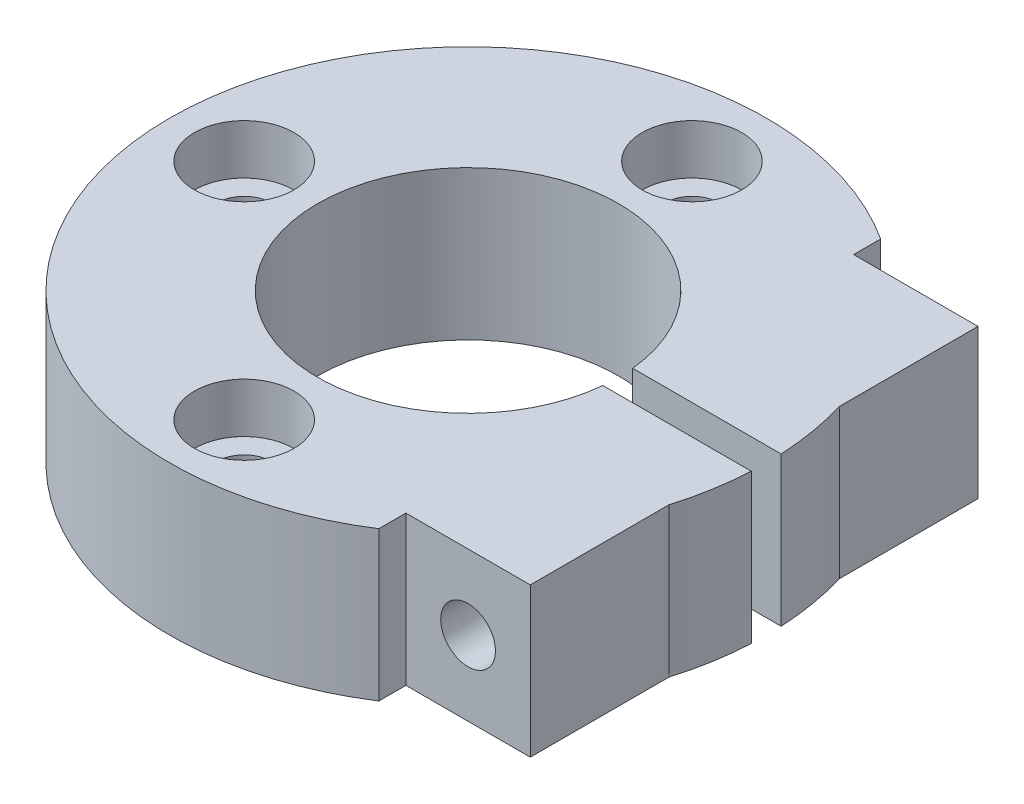
ISO-10303-21;
HEADER;
FILE_DESCRIPTION(('STEP AP214'),'2;1');
FILE_NAME('part.step','',(''),(''),'','','');
FILE_SCHEMA(('AUTOMOTIVE_DESIGN { 1 0 10303 214 1 1 1 1 }'));
ENDSEC;
DATA;
#1=APPLICATION_CONTEXT('core data for automotive mechanical design processes');
#2=APPLICATION_PROTOCOL_DEFINITION('international standard','automotive_design',2000,#1);
#3=PRODUCT_CONTEXT('',#1,'mechanical');
#4=PRODUCT('Part','Part','',(#3));
#5=PRODUCT_RELATED_PRODUCT_CATEGORY('part','',(#4));
#6=PRODUCT_DEFINITION_FORMATION('','',#4);
#7=PRODUCT_DEFINITION_CONTEXT('part definition',#1,'design');
#8=PRODUCT_DEFINITION('design','',#6,#7);
#9=PRODUCT_DEFINITION_SHAPE('','',#8);
#10=(LENGTH_UNIT() NAMED_UNIT(*) SI_UNIT(.MILLI.,.METRE.));
#11=(NAMED_UNIT(*) PLANE_ANGLE_UNIT() SI_UNIT($,.RADIAN.));
#12=(NAMED_UNIT(*) SI_UNIT($,.STERADIAN.) SOLID_ANGLE_UNIT());
#13=UNCERTAINTY_MEASURE_WITH_UNIT(LENGTH_MEASURE(1.E-05),#10,'distance_accuracy_value','');
#14=(GEOMETRIC_REPRESENTATION_CONTEXT(3) GLOBAL_UNCERTAINTY_ASSIGNED_CONTEXT((#13)) GLOBAL_UNIT_ASSIGNED_CONTEXT((#10,
#11,#12)) REPRESENTATION_CONTEXT('',''));
#15=CARTESIAN_POINT('',(0.,0.,0.));
#16=DIRECTION('',(0.,0.,1.));
#17=DIRECTION('',(1.,0.,0.));
#18=AXIS2_PLACEMENT_3D('',#15,#16,#17);
#19=CARTESIAN_POINT('',(-56.2916512459897,161.,0.));
#20=DIRECTION('',(0.,1.,0.));
#21=DIRECTION('',(0.,0.,-1.));
#22=AXIS2_PLACEMENT_3D('',#19,#20,#21);
#23=PLANE('',#22);
#24=CARTESIAN_POINT('',(-65.2916512459885,161.,0.));
#25=DIRECTION('',(0.,-1.,0.));
#26=DIRECTION('',(0.,0.,-1.));
#27=AXIS2_PLACEMENT_3D('',#24,#25,#26);
#28=CIRCLE('',#27,1.1);
#29=CARTESIAN_POINT('',(-65.2916512459885,161.,-1.1));
#30=VERTEX_POINT('',#29);
#31=EDGE_CURVE('E198',#30,#30,#28,.T.);
#32=ORIENTED_EDGE('',*,*,#31,.T.);
#33=EDGE_LOOP('',(#32));
#34=FACE_BOUND('',#33,.T.);
#35=CARTESIAN_POINT('',(-65.2916512459885,161.,0.));
#36=DIRECTION('',(0.,-1.,0.));
#37=DIRECTION('',(0.,0.,-1.));
#38=AXIS2_PLACEMENT_3D('',#35,#36,#37);
#39=CIRCLE('',#38,2.);
#40=CARTESIAN_POINT('',(-65.2916512459885,161.,-2.));
#41=VERTEX_POINT('',#40);
#42=EDGE_CURVE('E153',#41,#41,#39,.T.);
#43=ORIENTED_EDGE('',*,*,#42,.F.);
#44=EDGE_LOOP('',(#43));
#45=FACE_BOUND('',#44,.T.);
#46=ADVANCED_FACE('F41',(#34,#45),#23,.T.);
#47=CARTESIAN_POINT('',(-56.2916512459885,161.,-9.));
#48=DIRECTION('',(0.,-1.,0.));
#49=DIRECTION('',(0.,0.,-1.));
#50=AXIS2_PLACEMENT_3D('',#47,#48,#49);
#51=CIRCLE('',#50,1.1);
#52=CARTESIAN_POINT('',(-56.2916512459885,161.,-10.1));
#53=VERTEX_POINT('',#52);
#54=EDGE_CURVE('E188',#53,#53,#51,.T.);
#55=ORIENTED_EDGE('',*,*,#54,.T.);
#56=EDGE_LOOP('',(#55));
#57=FACE_BOUND('',#56,.T.);
#58=CARTESIAN_POINT('',(-56.2916512459885,161.,-9.));
#59=DIRECTION('',(0.,-1.,0.));
#60=DIRECTION('',(0.,0.,-1.));
#61=AXIS2_PLACEMENT_3D('',#58,#59,#60);
#62=CIRCLE('',#61,2.);
#63=CARTESIAN_POINT('',(-56.2916512459885,161.,-11.));
#64=VERTEX_POINT('',#63);
#65=EDGE_CURVE('E322',#64,#64,#62,.T.);
#66=ORIENTED_EDGE('',*,*,#65,.F.);
#67=EDGE_LOOP('',(#66));
#68=FACE_BOUND('',#67,.T.);
#69=ADVANCED_FACE('F300',(#57,#68),#23,.T.);
#70=CARTESIAN_POINT('',(-56.2916512459885,161.,9.));
#71=DIRECTION('',(0.,-1.,0.));
#72=DIRECTION('',(0.,0.,-1.));
#73=AXIS2_PLACEMENT_3D('',#70,#71,#72);
#74=CIRCLE('',#73,1.1);
#75=CARTESIAN_POINT('',(-56.2916512459885,161.,7.9));
#76=VERTEX_POINT('',#75);
#77=EDGE_CURVE('E184',#76,#76,#74,.T.);
#78=ORIENTED_EDGE('',*,*,#77,.T.);
#79=EDGE_LOOP('',(#78));
#80=FACE_BOUND('',#79,.T.);
#81=CARTESIAN_POINT('',(-56.2916512459885,161.,9.));
#82=DIRECTION('',(0.,-1.,0.));
#83=DIRECTION('',(0.,0.,-1.));
#84=AXIS2_PLACEMENT_3D('',#81,#82,#83);
#85=CIRCLE('',#84,2.);
#86=CARTESIAN_POINT('',(-56.2916512459885,161.,7.));
#87=VERTEX_POINT('',#86);
#88=EDGE_CURVE('E318',#87,#87,#85,.T.);
#89=ORIENTED_EDGE('',*,*,#88,.F.);
#90=EDGE_LOOP('',(#89));
#91=FACE_BOUND('',#90,.T.);
#92=ADVANCED_FACE('F301',(#80,#91),#23,.T.);
#93=CARTESIAN_POINT('',(-56.2916512459897,157.,0.));
#94=DIRECTION('',(0.,1.,0.));
#95=DIRECTION('',(0.,0.,-1.));
#96=AXIS2_PLACEMENT_3D('',#93,#94,#95);
#97=PLANE('',#96);
#98=CARTESIAN_POINT('',(-56.2916512459897,157.,0.));
#99=DIRECTION('',(0.,-1.,0.));
#100=DIRECTION('',(0.,0.,-1.));
#101=AXIS2_PLACEMENT_3D('',#98,#99,#100);
#102=CIRCLE('',#101,12.0000000000012);
#103=CARTESIAN_POINT('',(-44.3066606327256,157.,0.599999999999992));
#104=VERTEX_POINT('',#103);
#105=CARTESIAN_POINT('',(-44.7916512459885,157.,3.42782730020053));
#106=VERTEX_POINT('',#105);
#107=EDGE_CURVE('E200',#104,#106,#102,.T.);
#108=ORIENTED_EDGE('',*,*,#107,.T.);
#109=DIRECTION('',(0.,0.,1.));
#110=VECTOR('',#109,1.);
#111=CARTESIAN_POINT('',(-44.7916512459885,157.,3.42782730020053));
#112=LINE('',#111,#110);
#113=CARTESIAN_POINT('',(-44.7916512459885,157.,9.));
#114=VERTEX_POINT('',#113);
#115=EDGE_CURVE('E148',#106,#114,#112,.T.);
#116=ORIENTED_EDGE('',*,*,#115,.T.);
#117=DIRECTION('',(-1.,0.,0.));
#118=VECTOR('',#117,1.);
#119=CARTESIAN_POINT('',(-44.7916512459885,157.,9.));
#120=LINE('',#119,#118);
#121=CARTESIAN_POINT('',(-49.7916512459885,157.,9.));
#122=VERTEX_POINT('',#121);
#123=EDGE_CURVE('E204',#114,#122,#120,.T.);
#124=ORIENTED_EDGE('',*,*,#123,.T.);
#125=DIRECTION('',(0.,0.,1.));
#126=VECTOR('',#125,1.);
#127=CARTESIAN_POINT('',(-49.7916512459885,157.,9.));
#128=LINE('',#127,#126);
#129=CARTESIAN_POINT('',(-49.7916512459885,157.,10.087120500916));
#130=VERTEX_POINT('',#129);
#131=EDGE_CURVE('E210',#122,#130,#128,.T.);
#132=ORIENTED_EDGE('',*,*,#131,.T.);
#133=CARTESIAN_POINT('',(-56.2916512459897,157.,0.));
#134=DIRECTION('',(0.,-1.,0.));
#135=DIRECTION('',(0.,0.,-1.));
#136=AXIS2_PLACEMENT_3D('',#133,#134,#135);
#137=CIRCLE('',#136,12.0000000000006);
#138=CARTESIAN_POINT('',(-49.7916512459885,157.,-10.087120500916));
#139=VERTEX_POINT('',#138);
#140=EDGE_CURVE('E209',#130,#139,#137,.T.);
#141=ORIENTED_EDGE('',*,*,#140,.T.);
#142=DIRECTION('',(0.,0.,1.));
#143=VECTOR('',#142,1.);
#144=CARTESIAN_POINT('',(-49.7916512459885,157.,-10.087120500916));
#145=LINE('',#144,#143);
#146=CARTESIAN_POINT('',(-49.7916512459885,157.,-9.));
#147=VERTEX_POINT('',#146);
#148=EDGE_CURVE('E213',#139,#147,#145,.T.);
#149=ORIENTED_EDGE('',*,*,#148,.T.);
#150=DIRECTION('',(1.,0.,0.));
#151=VECTOR('',#150,1.);
#152=CARTESIAN_POINT('',(-44.7916512459885,157.,-9.));
#153=LINE('',#152,#151);
#154=CARTESIAN_POINT('',(-44.7916512459885,157.,-9.));
#155=VERTEX_POINT('',#154);
#156=EDGE_CURVE('E216',#147,#155,#153,.T.);
#157=ORIENTED_EDGE('',*,*,#156,.T.);
#158=DIRECTION('',(0.,0.,1.));
#159=VECTOR('',#158,1.);
#160=CARTESIAN_POINT('',(-44.7916512459885,157.,-9.));
#161=LINE('',#160,#159);
#162=CARTESIAN_POINT('',(-44.7916512459885,157.,-3.42782730020053));
#163=VERTEX_POINT('',#162);
#164=EDGE_CURVE('E218',#155,#163,#161,.T.);
#165=ORIENTED_EDGE('',*,*,#164,.T.);
#166=CARTESIAN_POINT('',(-56.2916512459897,157.,0.));
#167=DIRECTION('',(0.,-1.,0.));
#168=DIRECTION('',(0.,0.,-1.));
#169=AXIS2_PLACEMENT_3D('',#166,#167,#168);
#170=CIRCLE('',#169,12.0000000000012);
#171=CARTESIAN_POINT('',(-44.3066606327256,157.,-0.6));
#172=VERTEX_POINT('',#171);
#173=EDGE_CURVE('E225',#163,#172,#170,.T.);
#174=ORIENTED_EDGE('',*,*,#173,.T.);
#175=DIRECTION('',(-1.,0.,0.));
#176=VECTOR('',#175,1.);
#177=CARTESIAN_POINT('',(-44.3066606327256,157.,-0.6));
#178=LINE('',#177,#176);
#179=CARTESIAN_POINT('',(-50.2714768299106,157.,-0.600000000000006));
#180=VERTEX_POINT('',#179);
#181=EDGE_CURVE('E223',#172,#180,#178,.T.);
#182=ORIENTED_EDGE('',*,*,#181,.T.);
#183=CARTESIAN_POINT('',(-56.2916512459897,157.,0.));
#184=DIRECTION('',(0.,1.,0.));
#185=DIRECTION('',(0.,0.,-1.));
#186=AXIS2_PLACEMENT_3D('',#183,#184,#185);
#187=CIRCLE('',#186,6.05000000000116);
#188=CARTESIAN_POINT('',(-50.2714768299105,157.,0.599999999999976));
#189=VERTEX_POINT('',#188);
#190=EDGE_CURVE('E230',#180,#189,#187,.T.);
#191=ORIENTED_EDGE('',*,*,#190,.T.);
#192=DIRECTION('',(1.,0.,0.));
#193=VECTOR('',#192,1.);
#194=CARTESIAN_POINT('',(-44.3066606327256,157.,0.599999999999992));
#195=LINE('',#194,#193);
#196=EDGE_CURVE('E231',#189,#104,#195,.T.);
#197=ORIENTED_EDGE('',*,*,#196,.T.);
#198=EDGE_LOOP('',(#108,#116,#124,#132,#141,#149,#157,#165,#174,#182,#191,#197));
#199=FACE_BOUND('',#198,.T.);
#200=CARTESIAN_POINT('',(-65.2916512459885,157.,0.));
#201=DIRECTION('',(0.,-1.,0.));
#202=DIRECTION('',(0.,0.,-1.));
#203=AXIS2_PLACEMENT_3D('',#200,#201,#202);
#204=CIRCLE('',#203,1.1);
#205=CARTESIAN_POINT('',(-65.2916512459885,157.,-1.1));
#206=VERTEX_POINT('',#205);
#207=EDGE_CURVE('E194',#206,#206,#204,.T.);
#208=ORIENTED_EDGE('',*,*,#207,.F.);
#209=EDGE_LOOP('',(#208));
#210=FACE_BOUND('',#209,.T.);
#211=CARTESIAN_POINT('',(-56.2916512459885,157.,-9.));
#212=DIRECTION('',(0.,-1.,0.));
#213=DIRECTION('',(0.,0.,-1.));
#214=AXIS2_PLACEMENT_3D('',#211,#212,#213);
#215=CIRCLE('',#214,1.1);
#216=CARTESIAN_POINT('',(-56.2916512459885,157.,-10.1));
#217=VERTEX_POINT('',#216);
#218=EDGE_CURVE('E189',#217,#217,#215,.T.);
#219=ORIENTED_EDGE('',*,*,#218,.F.);
#220=EDGE_LOOP('',(#219));
#221=FACE_BOUND('',#220,.T.);
#222=CARTESIAN_POINT('',(-56.2916512459885,157.,9.));
#223=DIRECTION('',(0.,-1.,0.));
#224=DIRECTION('',(0.,0.,-1.));
#225=AXIS2_PLACEMENT_3D('',#222,#223,#224);
#226=CIRCLE('',#225,1.1);
#227=CARTESIAN_POINT('',(-56.2916512459885,157.,7.9));
#228=VERTEX_POINT('',#227);
#229=EDGE_CURVE('E181',#228,#228,#226,.T.);
#230=ORIENTED_EDGE('',*,*,#229,.F.);
#231=EDGE_LOOP('',(#230));
#232=FACE_BOUND('',#231,.T.);
#233=ADVANCED_FACE('F260',(#199,#210,#221,#232),#97,.F.);
#234=CARTESIAN_POINT('',(-56.2916512459897,161.,0.));
#235=DIRECTION('',(0.,-1.,0.));
#236=DIRECTION('',(0.,0.,1.));
#237=AXIS2_PLACEMENT_3D('',#234,#235,#236);
#238=CYLINDRICAL_SURFACE('',#237,12.0000000000012);
#239=ORIENTED_EDGE('',*,*,#107,.F.);
#240=DIRECTION('',(0.,-1.,0.));
#241=VECTOR('',#240,1.);
#242=CARTESIAN_POINT('',(-44.3066606327256,161.,0.599999999999992));
#243=LINE('',#242,#241);
#244=CARTESIAN_POINT('',(-44.3066606327256,163.,0.599999999999992));
#245=VERTEX_POINT('',#244);
#246=EDGE_CURVE('E60',#245,#104,#243,.T.);
#247=ORIENTED_EDGE('',*,*,#246,.F.);
#248=CARTESIAN_POINT('',(-56.2916512459897,163.,0.));
#249=DIRECTION('',(0.,-1.,0.));
#250=DIRECTION('',(0.,0.,-1.));
#251=AXIS2_PLACEMENT_3D('',#248,#249,#250);
#252=CIRCLE('',#251,12.0000000000012);
#253=CARTESIAN_POINT('',(-44.7916512459885,163.,3.42782730020053));
#254=VERTEX_POINT('',#253);
#255=EDGE_CURVE('E137',#245,#254,#252,.T.);
#256=ORIENTED_EDGE('',*,*,#255,.T.);
#257=DIRECTION('',(0.,-1.,0.));
#258=VECTOR('',#257,1.);
#259=CARTESIAN_POINT('',(-44.7916512459885,161.,3.42782730020053));
#260=LINE('',#259,#258);
#261=EDGE_CURVE('E11',#254,#106,#260,.T.);
#262=ORIENTED_EDGE('',*,*,#261,.T.);
#263=EDGE_LOOP('',(#239,#247,#256,#262));
#264=FACE_BOUND('',#263,.T.);
#265=ADVANCED_FACE('F43',(#264),#238,.T.);
#266=CARTESIAN_POINT('',(-44.7916512459885,161.,3.42782730020053));
#267=DIRECTION('',(-1.,0.,0.));
#268=DIRECTION('',(0.,0.,1.));
#269=AXIS2_PLACEMENT_3D('',#266,#267,#268);
#270=PLANE('',#269);
#271=ORIENTED_EDGE('',*,*,#115,.F.);
#272=ORIENTED_EDGE('',*,*,#261,.F.);
#273=DIRECTION('',(0.,0.,1.));
#274=VECTOR('',#273,1.);
#275=CARTESIAN_POINT('',(-44.7916512459885,163.,3.42782730020053));
#276=LINE('',#275,#274);
#277=CARTESIAN_POINT('',(-44.7916512459885,163.,9.));
#278=VERTEX_POINT('',#277);
#279=EDGE_CURVE('E134',#254,#278,#276,.T.);
#280=ORIENTED_EDGE('',*,*,#279,.T.);
#281=DIRECTION('',(0.,-1.,0.));
#282=VECTOR('',#281,1.);
#283=CARTESIAN_POINT('',(-44.7916512459885,161.,9.));
#284=LINE('',#283,#282);
#285=EDGE_CURVE('E49',#278,#114,#284,.T.);
#286=ORIENTED_EDGE('',*,*,#285,.T.);
#287=EDGE_LOOP('',(#271,#272,#280,#286));
#288=FACE_BOUND('',#287,.T.);
#289=ADVANCED_FACE('F145',(#288),#270,.F.);
#290=CARTESIAN_POINT('',(-44.7916512459885,161.,9.));
#291=DIRECTION('',(0.,0.,-1.));
#292=DIRECTION('',(-1.,0.,0.));
#293=AXIS2_PLACEMENT_3D('',#290,#291,#292);
#294=PLANE('',#293);
#295=CARTESIAN_POINT('',(-47.2916512459885,160.,9.));
#296=DIRECTION('',(0.,0.,1.));
#297=DIRECTION('',(-1.,0.,0.));
#298=AXIS2_PLACEMENT_3D('',#295,#296,#297);
#299=CIRCLE('',#298,1.1);
#300=CARTESIAN_POINT('',(-48.3916512459885,160.,9.));
#301=VERTEX_POINT('',#300);
#302=EDGE_CURVE('E321',#301,#301,#299,.F.);
#303=ORIENTED_EDGE('',*,*,#302,.T.);
#304=EDGE_LOOP('',(#303));
#305=FACE_BOUND('',#304,.T.);
#306=ORIENTED_EDGE('',*,*,#123,.F.);
#307=ORIENTED_EDGE('',*,*,#285,.F.);
#308=DIRECTION('',(-1.,0.,0.));
#309=VECTOR('',#308,1.);
#310=CARTESIAN_POINT('',(-44.7916512459885,163.,9.));
#311=LINE('',#310,#309);
#312=CARTESIAN_POINT('',(-49.7916512459885,163.,9.));
#313=VERTEX_POINT('',#312);
#314=EDGE_CURVE('E138',#278,#313,#311,.T.);
#315=ORIENTED_EDGE('',*,*,#314,.T.);
#316=DIRECTION('',(0.,-1.,0.));
#317=VECTOR('',#316,1.);
#318=CARTESIAN_POINT('',(-49.7916512459885,161.,9.));
#319=LINE('',#318,#317);
#320=EDGE_CURVE('E248',#313,#122,#319,.T.);
#321=ORIENTED_EDGE('',*,*,#320,.T.);
#322=EDGE_LOOP('',(#306,#307,#315,#321));
#323=FACE_BOUND('',#322,.T.);
#324=ADVANCED_FACE('F251',(#305,#323),#294,.F.);
#325=CARTESIAN_POINT('',(-49.7916512459885,161.,9.));
#326=DIRECTION('',(-1.,0.,0.));
#327=DIRECTION('',(0.,0.,1.));
#328=AXIS2_PLACEMENT_3D('',#325,#326,#327);
#329=PLANE('',#328);
#330=ORIENTED_EDGE('',*,*,#131,.F.);
#331=ORIENTED_EDGE('',*,*,#320,.F.);
#332=DIRECTION('',(0.,0.,1.));
#333=VECTOR('',#332,1.);
#334=CARTESIAN_POINT('',(-49.7916512459885,163.,9.));
#335=LINE('',#334,#333);
#336=CARTESIAN_POINT('',(-49.7916512459885,163.,10.087120500916));
#337=VERTEX_POINT('',#336);
#338=EDGE_CURVE('E158',#313,#337,#335,.T.);
#339=ORIENTED_EDGE('',*,*,#338,.T.);
#340=DIRECTION('',(0.,-1.,0.));
#341=VECTOR('',#340,1.);
#342=CARTESIAN_POINT('',(-49.7916512459885,161.,10.087120500916));
#343=LINE('',#342,#341);
#344=EDGE_CURVE('E247',#337,#130,#343,.T.);
#345=ORIENTED_EDGE('',*,*,#344,.T.);
#346=EDGE_LOOP('',(#330,#331,#339,#345));
#347=FACE_BOUND('',#346,.T.);
#348=ADVANCED_FACE('F287',(#347),#329,.F.);
#349=CARTESIAN_POINT('',(-56.2916512459897,161.,0.));
#350=DIRECTION('',(0.,-1.,0.));
#351=DIRECTION('',(0.,0.,1.));
#352=AXIS2_PLACEMENT_3D('',#349,#350,#351);
#353=CYLINDRICAL_SURFACE('',#352,12.0000000000006);
#354=ORIENTED_EDGE('',*,*,#140,.F.);
#355=ORIENTED_EDGE('',*,*,#344,.F.);
#356=CARTESIAN_POINT('',(-56.2916512459897,163.,0.));
#357=DIRECTION('',(0.,-1.,0.));
#358=DIRECTION('',(0.,0.,-1.));
#359=AXIS2_PLACEMENT_3D('',#356,#357,#358);
#360=CIRCLE('',#359,12.0000000000006);
#361=CARTESIAN_POINT('',(-49.7916512459885,163.,-10.087120500916));
#362=VERTEX_POINT('',#361);
#363=EDGE_CURVE('E161',#337,#362,#360,.T.);
#364=ORIENTED_EDGE('',*,*,#363,.T.);
#365=DIRECTION('',(0.,-1.,0.));
#366=VECTOR('',#365,1.);
#367=CARTESIAN_POINT('',(-49.7916512459885,161.,-10.087120500916));
#368=LINE('',#367,#366);
#369=EDGE_CURVE('E243',#362,#139,#368,.T.);
#370=ORIENTED_EDGE('',*,*,#369,.T.);
#371=EDGE_LOOP('',(#354,#355,#364,#370));
#372=FACE_BOUND('',#371,.T.);
#373=ADVANCED_FACE('F283',(#372),#353,.T.);
#374=CARTESIAN_POINT('',(-49.7916512459885,161.,-10.087120500916));
#375=DIRECTION('',(-1.,0.,0.));
#376=DIRECTION('',(0.,0.,1.));
#377=AXIS2_PLACEMENT_3D('',#374,#375,#376);
#378=PLANE('',#377);
#379=ORIENTED_EDGE('',*,*,#148,.F.);
#380=ORIENTED_EDGE('',*,*,#369,.F.);
#381=DIRECTION('',(0.,0.,1.));
#382=VECTOR('',#381,1.);
#383=CARTESIAN_POINT('',(-49.7916512459885,163.,-10.087120500916));
#384=LINE('',#383,#382);
#385=CARTESIAN_POINT('',(-49.7916512459885,163.,-9.));
#386=VERTEX_POINT('',#385);
#387=EDGE_CURVE('E163',#362,#386,#384,.T.);
#388=ORIENTED_EDGE('',*,*,#387,.T.);
#389=DIRECTION('',(0.,-1.,0.));
#390=VECTOR('',#389,1.);
#391=CARTESIAN_POINT('',(-49.7916512459885,161.,-9.));
#392=LINE('',#391,#390);
#393=EDGE_CURVE('E245',#386,#147,#392,.T.);
#394=ORIENTED_EDGE('',*,*,#393,.T.);
#395=EDGE_LOOP('',(#379,#380,#388,#394));
#396=FACE_BOUND('',#395,.T.);
#397=ADVANCED_FACE('F282',(#396),#378,.F.);
#398=CARTESIAN_POINT('',(-44.7916512459885,161.,-9.));
#399=DIRECTION('',(0.,0.,1.));
#400=DIRECTION('',(1.,0.,0.));
#401=AXIS2_PLACEMENT_3D('',#398,#399,#400);
#402=PLANE('',#401);
#403=CARTESIAN_POINT('',(-47.2916512459885,160.,-9.));
#404=DIRECTION('',(0.,0.,-1.));
#405=DIRECTION('',(1.,0.,0.));
#406=AXIS2_PLACEMENT_3D('',#403,#404,#405);
#407=CIRCLE('',#406,1.1);
#408=CARTESIAN_POINT('',(-46.1916512459885,160.,-9.));
#409=VERTEX_POINT('',#408);
#410=EDGE_CURVE('E330',#409,#409,#407,.F.);
#411=ORIENTED_EDGE('',*,*,#410,.T.);
#412=EDGE_LOOP('',(#411));
#413=FACE_BOUND('',#412,.T.);
#414=ORIENTED_EDGE('',*,*,#156,.F.);
#415=ORIENTED_EDGE('',*,*,#393,.F.);
#416=DIRECTION('',(1.,0.,0.));
#417=VECTOR('',#416,1.);
#418=CARTESIAN_POINT('',(-44.7916512459885,163.,-9.));
#419=LINE('',#418,#417);
#420=CARTESIAN_POINT('',(-44.7916512459885,163.,-9.));
#421=VERTEX_POINT('',#420);
#422=EDGE_CURVE('E170',#386,#421,#419,.T.);
#423=ORIENTED_EDGE('',*,*,#422,.T.);
#424=DIRECTION('',(0.,-1.,0.));
#425=VECTOR('',#424,1.);
#426=CARTESIAN_POINT('',(-44.7916512459885,161.,-9.));
#427=LINE('',#426,#425);
#428=EDGE_CURVE('E242',#421,#155,#427,.T.);
#429=ORIENTED_EDGE('',*,*,#428,.T.);
#430=EDGE_LOOP('',(#414,#415,#423,#429));
#431=FACE_BOUND('',#430,.T.);
#432=ADVANCED_FACE('F279',(#413,#431),#402,.F.);
#433=CARTESIAN_POINT('',(-44.7916512459885,161.,-9.));
#434=DIRECTION('',(-1.,0.,0.));
#435=DIRECTION('',(0.,0.,1.));
#436=AXIS2_PLACEMENT_3D('',#433,#434,#435);
#437=PLANE('',#436);
#438=ORIENTED_EDGE('',*,*,#164,.F.);
#439=ORIENTED_EDGE('',*,*,#428,.F.);
#440=DIRECTION('',(0.,0.,1.));
#441=VECTOR('',#440,1.);
#442=CARTESIAN_POINT('',(-44.7916512459885,163.,-9.));
#443=LINE('',#442,#441);
#444=CARTESIAN_POINT('',(-44.7916512459885,163.,-3.42782730020053));
#445=VERTEX_POINT('',#444);
#446=EDGE_CURVE('E168',#421,#445,#443,.T.);
#447=ORIENTED_EDGE('',*,*,#446,.T.);
#448=DIRECTION('',(0.,-1.,0.));
#449=VECTOR('',#448,1.);
#450=CARTESIAN_POINT('',(-44.7916512459885,161.,-3.42782730020053));
#451=LINE('',#450,#449);
#452=EDGE_CURVE('E239',#445,#163,#451,.T.);
#453=ORIENTED_EDGE('',*,*,#452,.T.);
#454=EDGE_LOOP('',(#438,#439,#447,#453));
#455=FACE_BOUND('',#454,.T.);
#456=ADVANCED_FACE('F272',(#455),#437,.F.);
#457=CARTESIAN_POINT('',(-56.2916512459897,161.,0.));
#458=DIRECTION('',(0.,-1.,0.));
#459=DIRECTION('',(0.,0.,1.));
#460=AXIS2_PLACEMENT_3D('',#457,#458,#459);
#461=CYLINDRICAL_SURFACE('',#460,12.0000000000012);
#462=ORIENTED_EDGE('',*,*,#173,.F.);
#463=ORIENTED_EDGE('',*,*,#452,.F.);
#464=CARTESIAN_POINT('',(-56.2916512459897,163.,0.));
#465=DIRECTION('',(0.,-1.,0.));
#466=DIRECTION('',(0.,0.,-1.));
#467=AXIS2_PLACEMENT_3D('',#464,#465,#466);
#468=CIRCLE('',#467,12.0000000000012);
#469=CARTESIAN_POINT('',(-44.3066606327256,163.,-0.6));
#470=VERTEX_POINT('',#469);
#471=EDGE_CURVE('E175',#445,#470,#468,.T.);
#472=ORIENTED_EDGE('',*,*,#471,.T.);
#473=DIRECTION('',(0.,-1.,0.));
#474=VECTOR('',#473,1.);
#475=CARTESIAN_POINT('',(-44.3066606327256,161.,-0.6));
#476=LINE('',#475,#474);
#477=EDGE_CURVE('E240',#470,#172,#476,.T.);
#478=ORIENTED_EDGE('',*,*,#477,.T.);
#479=EDGE_LOOP('',(#462,#463,#472,#478));
#480=FACE_BOUND('',#479,.T.);
#481=ADVANCED_FACE('F267',(#480),#461,.T.);
#482=CARTESIAN_POINT('',(-44.3066606327256,161.,-0.6));
#483=DIRECTION('',(0.,0.,-1.));
#484=DIRECTION('',(-1.,0.,0.));
#485=AXIS2_PLACEMENT_3D('',#482,#483,#484);
#486=PLANE('',#485);
#487=CARTESIAN_POINT('',(-47.2916512459885,160.,-0.6));
#488=DIRECTION('',(0.,0.,1.));
#489=DIRECTION('',(-1.,0.,0.));
#490=AXIS2_PLACEMENT_3D('',#487,#488,#489);
#491=CIRCLE('',#490,1.1);
#492=CARTESIAN_POINT('',(-48.3916512459885,160.,-0.6));
#493=VERTEX_POINT('',#492);
#494=EDGE_CURVE('E581',#493,#493,#491,.F.);
#495=ORIENTED_EDGE('',*,*,#494,.T.);
#496=EDGE_LOOP('',(#495));
#497=FACE_BOUND('',#496,.T.);
#498=ORIENTED_EDGE('',*,*,#181,.F.);
#499=ORIENTED_EDGE('',*,*,#477,.F.);
#500=DIRECTION('',(-1.,0.,0.));
#501=VECTOR('',#500,1.);
#502=CARTESIAN_POINT('',(-44.3066606327256,163.,-0.6));
#503=LINE('',#502,#501);
#504=CARTESIAN_POINT('',(-50.2714768299106,163.,-0.600000000000006));
#505=VERTEX_POINT('',#504);
#506=EDGE_CURVE('E176',#470,#505,#503,.T.);
#507=ORIENTED_EDGE('',*,*,#506,.T.);
#508=DIRECTION('',(0.,-1.,0.));
#509=VECTOR('',#508,1.);
#510=CARTESIAN_POINT('',(-50.2714768299106,161.,-0.600000000000006));
#511=LINE('',#510,#509);
#512=EDGE_CURVE('E235',#505,#180,#511,.T.);
#513=ORIENTED_EDGE('',*,*,#512,.T.);
#514=EDGE_LOOP('',(#498,#499,#507,#513));
#515=FACE_BOUND('',#514,.T.);
#516=ADVANCED_FACE('F266',(#497,#515),#486,.F.);
#517=CARTESIAN_POINT('',(-56.2916512459897,161.,0.));
#518=DIRECTION('',(0.,-1.,0.));
#519=DIRECTION('',(0.,0.,1.));
#520=AXIS2_PLACEMENT_3D('',#517,#518,#519);
#521=CYLINDRICAL_SURFACE('',#520,6.05000000000116);
#522=ORIENTED_EDGE('',*,*,#190,.F.);
#523=ORIENTED_EDGE('',*,*,#512,.F.);
#524=CARTESIAN_POINT('',(-56.2916512459897,163.,0.));
#525=DIRECTION('',(0.,1.,0.));
#526=DIRECTION('',(0.,0.,-1.));
#527=AXIS2_PLACEMENT_3D('',#524,#525,#526);
#528=CIRCLE('',#527,6.05000000000116);
#529=CARTESIAN_POINT('',(-50.2714768299105,163.,0.599999999999976));
#530=VERTEX_POINT('',#529);
#531=EDGE_CURVE('E178',#505,#530,#528,.T.);
#532=ORIENTED_EDGE('',*,*,#531,.T.);
#533=DIRECTION('',(0.,-1.,0.));
#534=VECTOR('',#533,1.);
#535=CARTESIAN_POINT('',(-50.2714768299105,161.,0.599999999999976));
#536=LINE('',#535,#534);
#537=EDGE_CURVE('E63',#530,#189,#536,.T.);
#538=ORIENTED_EDGE('',*,*,#537,.T.);
#539=EDGE_LOOP('',(#522,#523,#532,#538));
#540=FACE_BOUND('',#539,.T.);
#541=ADVANCED_FACE('F261',(#540),#521,.F.);
#542=CARTESIAN_POINT('',(-44.3066606327256,161.,0.599999999999992));
#543=DIRECTION('',(0.,0.,1.));
#544=DIRECTION('',(1.,0.,0.));
#545=AXIS2_PLACEMENT_3D('',#542,#543,#544);
#546=PLANE('',#545);
#547=CARTESIAN_POINT('',(-47.2916512459885,160.,0.599999999999983));
#548=DIRECTION('',(0.,0.,-1.));
#549=DIRECTION('',(1.,0.,0.));
#550=AXIS2_PLACEMENT_3D('',#547,#548,#549);
#551=CIRCLE('',#550,1.1);
#552=CARTESIAN_POINT('',(-46.1916512459885,160.,0.599999999999985));
#553=VERTEX_POINT('',#552);
#554=EDGE_CURVE('E44',#553,#553,#551,.F.);
#555=ORIENTED_EDGE('',*,*,#554,.T.);
#556=EDGE_LOOP('',(#555));
#557=FACE_BOUND('',#556,.T.);
#558=ORIENTED_EDGE('',*,*,#196,.F.);
#559=ORIENTED_EDGE('',*,*,#537,.F.);
#560=DIRECTION('',(1.,0.,0.));
#561=VECTOR('',#560,1.);
#562=CARTESIAN_POINT('',(-44.3066606327256,163.,0.599999999999992));
#563=LINE('',#562,#561);
#564=EDGE_CURVE('E182',#530,#245,#563,.T.);
#565=ORIENTED_EDGE('',*,*,#564,.T.);
#566=ORIENTED_EDGE('',*,*,#246,.T.);
#567=EDGE_LOOP('',(#558,#559,#565,#566));
#568=FACE_BOUND('',#567,.T.);
#569=ADVANCED_FACE('F259',(#557,#568),#546,.F.);
#570=CARTESIAN_POINT('',(-65.2916512459885,161.,0.));
#571=DIRECTION('',(0.,-1.,0.));
#572=DIRECTION('',(0.,0.,1.));
#573=AXIS2_PLACEMENT_3D('',#570,#571,#572);
#574=CYLINDRICAL_SURFACE('',#573,1.1);
#575=ORIENTED_EDGE('',*,*,#31,.F.);
#576=EDGE_LOOP('',(#575));
#577=FACE_BOUND('',#576,.T.);
#578=ORIENTED_EDGE('',*,*,#207,.T.);
#579=EDGE_LOOP('',(#578));
#580=FACE_BOUND('',#579,.T.);
#581=ADVANCED_FACE('F365',(#577,#580),#574,.F.);
#582=CARTESIAN_POINT('',(-56.2916512459885,161.,-9.));
#583=DIRECTION('',(0.,-1.,0.));
#584=DIRECTION('',(0.,0.,1.));
#585=AXIS2_PLACEMENT_3D('',#582,#583,#584);
#586=CYLINDRICAL_SURFACE('',#585,1.1);
#587=ORIENTED_EDGE('',*,*,#54,.F.);
#588=EDGE_LOOP('',(#587));
#589=FACE_BOUND('',#588,.T.);
#590=ORIENTED_EDGE('',*,*,#218,.T.);
#591=EDGE_LOOP('',(#590));
#592=FACE_BOUND('',#591,.T.);
#593=ADVANCED_FACE('F363',(#589,#592),#586,.F.);
#594=CARTESIAN_POINT('',(-56.2916512459885,161.,9.));
#595=DIRECTION('',(0.,-1.,0.));
#596=DIRECTION('',(0.,0.,1.));
#597=AXIS2_PLACEMENT_3D('',#594,#595,#596);
#598=CYLINDRICAL_SURFACE('',#597,1.1);
#599=ORIENTED_EDGE('',*,*,#77,.F.);
#600=EDGE_LOOP('',(#599));
#601=FACE_BOUND('',#600,.T.);
#602=ORIENTED_EDGE('',*,*,#229,.T.);
#603=EDGE_LOOP('',(#602));
#604=FACE_BOUND('',#603,.T.);
#605=ADVANCED_FACE('F357',(#601,#604),#598,.F.);
#606=CARTESIAN_POINT('',(-56.2916512459897,163.,0.));
#607=DIRECTION('',(0.,1.,0.));
#608=DIRECTION('',(0.,0.,-1.));
#609=AXIS2_PLACEMENT_3D('',#606,#607,#608);
#610=PLANE('',#609);
#611=CARTESIAN_POINT('',(-56.2916512459885,163.,-9.));
#612=DIRECTION('',(0.,-1.,0.));
#613=DIRECTION('',(0.,0.,-1.));
#614=AXIS2_PLACEMENT_3D('',#611,#612,#613);
#615=CIRCLE('',#614,2.);
#616=CARTESIAN_POINT('',(-56.2916512459885,163.,-11.));
#617=VERTEX_POINT('',#616);
#618=EDGE_CURVE('E329',#617,#617,#615,.T.);
#619=ORIENTED_EDGE('',*,*,#618,.T.);
#620=EDGE_LOOP('',(#619));
#621=FACE_BOUND('',#620,.T.);
#622=ORIENTED_EDGE('',*,*,#255,.F.);
#623=ORIENTED_EDGE('',*,*,#564,.F.);
#624=ORIENTED_EDGE('',*,*,#531,.F.);
#625=ORIENTED_EDGE('',*,*,#506,.F.);
#626=ORIENTED_EDGE('',*,*,#471,.F.);
#627=ORIENTED_EDGE('',*,*,#446,.F.);
#628=ORIENTED_EDGE('',*,*,#422,.F.);
#629=ORIENTED_EDGE('',*,*,#387,.F.);
#630=ORIENTED_EDGE('',*,*,#363,.F.);
#631=ORIENTED_EDGE('',*,*,#338,.F.);
#632=ORIENTED_EDGE('',*,*,#314,.F.);
#633=ORIENTED_EDGE('',*,*,#279,.F.);
#634=EDGE_LOOP('',(#622,#623,#624,#625,#626,#627,#628,#629,#630,#631,#632,#633));
#635=FACE_BOUND('',#634,.T.);
#636=CARTESIAN_POINT('',(-65.2916512459885,163.,0.));
#637=DIRECTION('',(0.,-1.,0.));
#638=DIRECTION('',(0.,0.,-1.));
#639=AXIS2_PLACEMENT_3D('',#636,#637,#638);
#640=CIRCLE('',#639,2.);
#641=CARTESIAN_POINT('',(-65.2916512459885,163.,-2.));
#642=VERTEX_POINT('',#641);
#643=EDGE_CURVE('E147',#642,#642,#640,.T.);
#644=ORIENTED_EDGE('',*,*,#643,.T.);
#645=EDGE_LOOP('',(#644));
#646=FACE_BOUND('',#645,.T.);
#647=CARTESIAN_POINT('',(-56.2916512459885,163.,9.));
#648=DIRECTION('',(0.,-1.,0.));
#649=DIRECTION('',(0.,0.,-1.));
#650=AXIS2_PLACEMENT_3D('',#647,#648,#649);
#651=CIRCLE('',#650,2.);
#652=CARTESIAN_POINT('',(-56.2916512459885,163.,7.));
#653=VERTEX_POINT('',#652);
#654=EDGE_CURVE('E319',#653,#653,#651,.T.);
#655=ORIENTED_EDGE('',*,*,#654,.T.);
#656=EDGE_LOOP('',(#655));
#657=FACE_BOUND('',#656,.T.);
#658=ADVANCED_FACE('F131',(#621,#635,#646,#657),#610,.T.);
#659=CARTESIAN_POINT('',(-65.2916512459885,163.,0.));
#660=DIRECTION('',(0.,-1.,0.));
#661=DIRECTION('',(0.,0.,1.));
#662=AXIS2_PLACEMENT_3D('',#659,#660,#661);
#663=CYLINDRICAL_SURFACE('',#662,2.);
#664=ORIENTED_EDGE('',*,*,#643,.F.);
#665=EDGE_LOOP('',(#664));
#666=FACE_BOUND('',#665,.T.);
#667=ORIENTED_EDGE('',*,*,#42,.T.);
#668=EDGE_LOOP('',(#667));
#669=FACE_BOUND('',#668,.T.);
#670=ADVANCED_FACE('F338',(#666,#669),#663,.F.);
#671=CARTESIAN_POINT('',(-56.2916512459885,163.,-9.));
#672=DIRECTION('',(0.,-1.,0.));
#673=DIRECTION('',(0.,0.,1.));
#674=AXIS2_PLACEMENT_3D('',#671,#672,#673);
#675=CYLINDRICAL_SURFACE('',#674,2.);
#676=ORIENTED_EDGE('',*,*,#618,.F.);
#677=EDGE_LOOP('',(#676));
#678=FACE_BOUND('',#677,.T.);
#679=ORIENTED_EDGE('',*,*,#65,.T.);
#680=EDGE_LOOP('',(#679));
#681=FACE_BOUND('',#680,.T.);
#682=ADVANCED_FACE('F337',(#678,#681),#675,.F.);
#683=CARTESIAN_POINT('',(-56.2916512459885,163.,9.));
#684=DIRECTION('',(0.,-1.,0.));
#685=DIRECTION('',(0.,0.,1.));
#686=AXIS2_PLACEMENT_3D('',#683,#684,#685);
#687=CYLINDRICAL_SURFACE('',#686,2.);
#688=ORIENTED_EDGE('',*,*,#654,.F.);
#689=EDGE_LOOP('',(#688));
#690=FACE_BOUND('',#689,.T.);
#691=ORIENTED_EDGE('',*,*,#88,.T.);
#692=EDGE_LOOP('',(#691));
#693=FACE_BOUND('',#692,.T.);
#694=ADVANCED_FACE('F336',(#690,#693),#687,.F.);
#695=CARTESIAN_POINT('',(-47.2916512459885,160.,12.));
#696=DIRECTION('',(0.,0.,-1.));
#697=DIRECTION('',(-1.,0.,0.));
#698=AXIS2_PLACEMENT_3D('',#695,#696,#697);
#699=CYLINDRICAL_SURFACE('',#698,1.1);
#700=ORIENTED_EDGE('',*,*,#554,.F.);
#701=EDGE_LOOP('',(#700));
#702=FACE_BOUND('',#701,.T.);
#703=ORIENTED_EDGE('',*,*,#302,.F.);
#704=EDGE_LOOP('',(#703));
#705=FACE_BOUND('',#704,.T.);
#706=ADVANCED_FACE('F350',(#702,#705),#699,.F.);
#707=ORIENTED_EDGE('',*,*,#494,.F.);
#708=EDGE_LOOP('',(#707));
#709=FACE_BOUND('',#708,.T.);
#710=ORIENTED_EDGE('',*,*,#410,.F.);
#711=EDGE_LOOP('',(#710));
#712=FACE_BOUND('',#711,.T.);
#713=ADVANCED_FACE('F490',(#709,#712),#699,.F.);
#714=CLOSED_SHELL('',(#46,#69,#92,#233,#265,#289,#324,#348,#373,#397,#432,#456,#481,#516,#541,
#569,#581,#593,#605,#658,#670,#682,#694,#706,#713));
#715=MANIFOLD_SOLID_BREP('B2',#714);
#716=ADVANCED_BREP_SHAPE_REPRESENTATION('',(#18,#715),#14);
#717=SHAPE_DEFINITION_REPRESENTATION(#9,#716);
ENDSEC;
END-ISO-10303-21;
